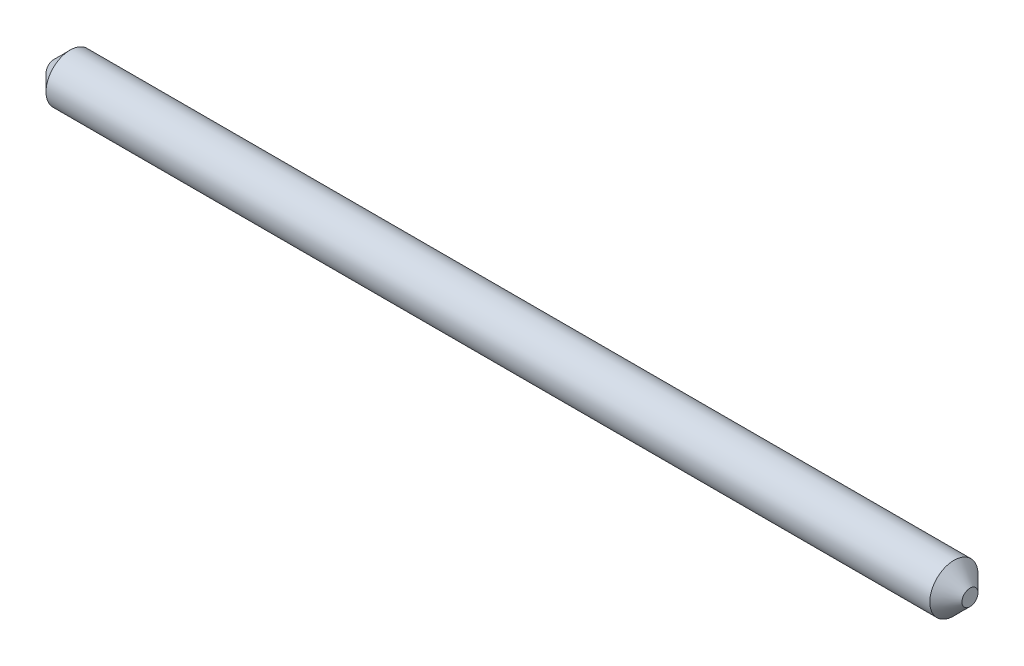
ISO-10303-21;
HEADER;
FILE_DESCRIPTION(('STEP AP214'),'2;1');
FILE_NAME('part.step','',(''),(''),'','','');
FILE_SCHEMA(('AUTOMOTIVE_DESIGN { 1 0 10303 214 1 1 1 1 }'));
ENDSEC;
DATA;
#1=APPLICATION_CONTEXT('core data for automotive mechanical design processes');
#2=APPLICATION_PROTOCOL_DEFINITION('international standard','automotive_design',2000,#1);
#3=PRODUCT_CONTEXT('',#1,'mechanical');
#4=PRODUCT('Part','Part','',(#3));
#5=PRODUCT_RELATED_PRODUCT_CATEGORY('part','',(#4));
#6=PRODUCT_DEFINITION_FORMATION('','',#4);
#7=PRODUCT_DEFINITION_CONTEXT('part definition',#1,'design');
#8=PRODUCT_DEFINITION('design','',#6,#7);
#9=PRODUCT_DEFINITION_SHAPE('','',#8);
#10=(LENGTH_UNIT() NAMED_UNIT(*) SI_UNIT(.MILLI.,.METRE.));
#11=(NAMED_UNIT(*) PLANE_ANGLE_UNIT() SI_UNIT($,.RADIAN.));
#12=(NAMED_UNIT(*) SI_UNIT($,.STERADIAN.) SOLID_ANGLE_UNIT());
#13=UNCERTAINTY_MEASURE_WITH_UNIT(LENGTH_MEASURE(1.E-05),#10,'distance_accuracy_value','');
#14=(GEOMETRIC_REPRESENTATION_CONTEXT(3) GLOBAL_UNCERTAINTY_ASSIGNED_CONTEXT((#13)) GLOBAL_UNIT_ASSIGNED_CONTEXT((#10,
#11,#12)) REPRESENTATION_CONTEXT('',''));
#15=CARTESIAN_POINT('',(0.,0.,0.));
#16=DIRECTION('',(0.,0.,1.));
#17=DIRECTION('',(1.,0.,0.));
#18=AXIS2_PLACEMENT_3D('',#15,#16,#17);
#19=CARTESIAN_POINT('',(28.5,0.,0.));
#20=DIRECTION('',(-1.,0.,0.));
#21=DIRECTION('',(0.,0.,1.));
#22=AXIS2_PLACEMENT_3D('',#19,#20,#21);
#23=CYLINDRICAL_SURFACE('',#22,1.5);
#24=CARTESIAN_POINT('',(-27.5,0.,0.));
#25=DIRECTION('',(1.,0.,0.));
#26=DIRECTION('',(0.,0.,-1.));
#27=AXIS2_PLACEMENT_3D('',#24,#25,#26);
#28=CIRCLE('',#27,1.5);
#29=CARTESIAN_POINT('',(-27.5,0.,1.5));
#30=VERTEX_POINT('',#29);
#31=EDGE_CURVE('E53',#30,#30,#28,.T.);
#32=CARTESIAN_POINT('',(27.5,0.,0.));
#33=DIRECTION('',(1.,0.,0.));
#34=DIRECTION('',(0.,0.,-1.));
#35=AXIS2_PLACEMENT_3D('',#32,#33,#34);
#36=CIRCLE('',#35,1.5);
#37=CARTESIAN_POINT('',(27.5,0.,1.5));
#38=VERTEX_POINT('',#37);
#39=EDGE_CURVE('E59',#38,#38,#36,.F.);
#40=CARTESIAN_POINT('',(-27.5,0.,1.5));
#41=CARTESIAN_POINT('',(-26.9270833333333,0.,1.5));
#42=CARTESIAN_POINT('',(-26.3541666666667,0.,1.5));
#43=CARTESIAN_POINT('',(-25.2083333333333,0.,1.5));
#44=CARTESIAN_POINT('',(-24.6354166666667,0.,1.5));
#45=CARTESIAN_POINT('',(-23.4895833333333,0.,1.5));
#46=CARTESIAN_POINT('',(-22.9166666666667,0.,1.5));
#47=CARTESIAN_POINT('',(-21.7708333333333,0.,1.5));
#48=CARTESIAN_POINT('',(-21.1979166666667,0.,1.5));
#49=CARTESIAN_POINT('',(-20.0520833333333,0.,1.5));
#50=CARTESIAN_POINT('',(-19.4791666666667,0.,1.5));
#51=CARTESIAN_POINT('',(-18.3333333333333,0.,1.5));
#52=CARTESIAN_POINT('',(-17.7604166666667,0.,1.5));
#53=CARTESIAN_POINT('',(-16.6145833333333,0.,1.5));
#54=CARTESIAN_POINT('',(-16.0416666666667,0.,1.5));
#55=CARTESIAN_POINT('',(-14.8958333333333,0.,1.5));
#56=CARTESIAN_POINT('',(-14.3229166666667,0.,1.5));
#57=CARTESIAN_POINT('',(-13.1770833333333,0.,1.5));
#58=CARTESIAN_POINT('',(-12.6041666666667,0.,1.5));
#59=CARTESIAN_POINT('',(-11.4583333333333,0.,1.5));
#60=CARTESIAN_POINT('',(-10.8854166666667,0.,1.5));
#61=CARTESIAN_POINT('',(-9.73958333333332,0.,1.5));
#62=CARTESIAN_POINT('',(-9.16666666666666,0.,1.5));
#63=CARTESIAN_POINT('',(-8.02083333333332,0.,1.5));
#64=CARTESIAN_POINT('',(-7.44791666666665,0.,1.5));
#65=CARTESIAN_POINT('',(-6.30208333333332,0.,1.5));
#66=CARTESIAN_POINT('',(-5.72916666666665,0.,1.5));
#67=CARTESIAN_POINT('',(-4.58333333333332,0.,1.5));
#68=CARTESIAN_POINT('',(-4.01041666666666,0.,1.5));
#69=CARTESIAN_POINT('',(-2.86458333333332,0.,1.5));
#70=CARTESIAN_POINT('',(-2.29166666666666,0.,1.5));
#71=CARTESIAN_POINT('',(-1.14583333333332,0.,1.5));
#72=CARTESIAN_POINT('',(-0.572916666666657,0.,1.5));
#73=CARTESIAN_POINT('',(0.572916666666678,0.,1.5));
#74=CARTESIAN_POINT('',(1.14583333333334,0.,1.5));
#75=CARTESIAN_POINT('',(2.29166666666668,0.,1.5));
#76=CARTESIAN_POINT('',(2.86458333333334,0.,1.5));
#77=CARTESIAN_POINT('',(4.01041666666668,0.,1.5));
#78=CARTESIAN_POINT('',(4.58333333333334,0.,1.5));
#79=CARTESIAN_POINT('',(5.72916666666668,0.,1.5));
#80=CARTESIAN_POINT('',(6.30208333333334,0.,1.5));
#81=CARTESIAN_POINT('',(7.44791666666668,0.,1.5));
#82=CARTESIAN_POINT('',(8.02083333333335,0.,1.5));
#83=CARTESIAN_POINT('',(9.16666666666668,0.,1.5));
#84=CARTESIAN_POINT('',(9.73958333333335,0.,1.5));
#85=CARTESIAN_POINT('',(10.8854166666667,0.,1.5));
#86=CARTESIAN_POINT('',(11.4583333333333,0.,1.5));
#87=CARTESIAN_POINT('',(12.6041666666667,0.,1.5));
#88=CARTESIAN_POINT('',(13.1770833333333,0.,1.5));
#89=CARTESIAN_POINT('',(14.3229166666667,0.,1.5));
#90=CARTESIAN_POINT('',(14.8958333333333,0.,1.5));
#91=CARTESIAN_POINT('',(16.0416666666667,0.,1.5));
#92=CARTESIAN_POINT('',(16.6145833333333,0.,1.5));
#93=CARTESIAN_POINT('',(17.7604166666667,0.,1.5));
#94=CARTESIAN_POINT('',(18.3333333333333,0.,1.5));
#95=CARTESIAN_POINT('',(19.4791666666667,0.,1.5));
#96=CARTESIAN_POINT('',(20.0520833333333,0.,1.5));
#97=CARTESIAN_POINT('',(21.1979166666667,0.,1.5));
#98=CARTESIAN_POINT('',(21.7708333333333,0.,1.5));
#99=CARTESIAN_POINT('',(22.9166666666667,0.,1.5));
#100=CARTESIAN_POINT('',(23.4895833333333,0.,1.5));
#101=CARTESIAN_POINT('',(24.6354166666667,0.,1.5));
#102=CARTESIAN_POINT('',(25.2083333333333,0.,1.5));
#103=CARTESIAN_POINT('',(26.3541666666667,0.,1.5));
#104=CARTESIAN_POINT('',(26.9270833333333,0.,1.5));
#105=CARTESIAN_POINT('',(27.5,0.,1.5));
#106=B_SPLINE_CURVE_WITH_KNOTS('',3,(#40,#41,#42,#43,#44,#45,#46,#47,#48,#49,#50,#51,#52,#53,
#54,#55,#56,#57,#58,#59,#60,#61,#62,#63,#64,#65,#66,#67,#68,#69,#70,#71,#72,#73,#74,#75,#76,#77,
#78,#79,#80,#81,#82,#83,#84,#85,#86,#87,#88,#89,#90,#91,#92,#93,#94,#95,#96,#97,#98,#99,#100,
#101,#102,#103,#104,#105),.UNSPECIFIED.,.F.,.F.,(4,2,2,2,2,2,2,2,2,2,2,2,2,2,2,2,2,2,2,2,2,2,2,
2,2,2,2,2,2,2,2,2,4),(0.,1.71875,3.4375,5.15625,6.875,8.59375,10.3125,12.03125,13.75,15.46875,
17.1875,18.90625,20.625,22.34375,24.0625,25.78125,27.5,29.21875,30.9375,32.65625,34.375,
36.09375,37.8125,39.53125,41.25,42.96875,44.6875,46.40625,48.125,49.84375,51.5625,53.28125,55.),.UNSPECIFIED.);
#107=EDGE_CURVE('BSEAM38',#30,#38,#106,.T.);
#108=ORIENTED_EDGE('',*,*,#31,.T.);
#109=ORIENTED_EDGE('',*,*,#39,.T.);
#110=ORIENTED_EDGE('',*,*,#107,.T.);
#111=ORIENTED_EDGE('',*,*,#107,.F.);
#112=EDGE_LOOP('',(#108,#110,#109,#111));
#113=FACE_BOUND('',#112,.T.);
#114=ADVANCED_FACE('F38',(#113),#23,.T.);
#115=CARTESIAN_POINT('',(28.5,0.,0.));
#116=DIRECTION('',(1.,0.,0.));
#117=DIRECTION('',(0.,0.,-1.));
#118=AXIS2_PLACEMENT_3D('',#115,#116,#117);
#119=PLANE('',#118);
#120=CARTESIAN_POINT('',(28.5,0.,0.));
#121=DIRECTION('',(1.,0.,0.));
#122=DIRECTION('',(0.,0.,-1.));
#123=AXIS2_PLACEMENT_3D('',#120,#121,#122);
#124=CIRCLE('',#123,0.500000000000021);
#125=CARTESIAN_POINT('',(28.5,0.,0.500000000000023));
#126=VERTEX_POINT('',#125);
#127=EDGE_CURVE('E10',#126,#126,#124,.T.);
#128=ORIENTED_EDGE('',*,*,#127,.T.);
#129=EDGE_LOOP('',(#128));
#130=FACE_BOUND('',#129,.T.);
#131=ADVANCED_FACE('F77',(#130),#119,.T.);
#132=CARTESIAN_POINT('',(-28.5,0.,0.));
#133=DIRECTION('',(1.,0.,0.));
#134=DIRECTION('',(0.,0.,-1.));
#135=AXIS2_PLACEMENT_3D('',#132,#133,#134);
#136=PLANE('',#135);
#137=CARTESIAN_POINT('',(-28.5,0.,0.));
#138=DIRECTION('',(1.,0.,0.));
#139=DIRECTION('',(0.,0.,-1.));
#140=AXIS2_PLACEMENT_3D('',#137,#138,#139);
#141=CIRCLE('',#140,0.499999999999951);
#142=CARTESIAN_POINT('',(-28.5,0.,-0.499999999999951));
#143=VERTEX_POINT('',#142);
#144=EDGE_CURVE('E47',#143,#143,#141,.F.);
#145=ORIENTED_EDGE('',*,*,#144,.T.);
#146=EDGE_LOOP('',(#145));
#147=FACE_BOUND('',#146,.T.);
#148=ADVANCED_FACE('F74',(#147),#136,.F.);
#149=CARTESIAN_POINT('',(-27.5,0.,0.));
#150=DIRECTION('',(1.,0.,0.));
#151=DIRECTION('',(0.,0.,-1.));
#152=AXIS2_PLACEMENT_3D('',#149,#150,#151);
#153=CONICAL_SURFACE('',#152,1.5,0.785398163397462);
#154=ORIENTED_EDGE('',*,*,#144,.F.);
#155=EDGE_LOOP('',(#154));
#156=FACE_BOUND('',#155,.T.);
#157=ORIENTED_EDGE('',*,*,#31,.F.);
#158=EDGE_LOOP('',(#157));
#159=FACE_BOUND('',#158,.T.);
#160=ADVANCED_FACE('F70',(#156,#159),#153,.T.);
#161=CARTESIAN_POINT('',(28.5,0.,0.));
#162=DIRECTION('',(-1.,0.,0.));
#163=DIRECTION('',(0.,0.,1.));
#164=AXIS2_PLACEMENT_3D('',#161,#162,#163);
#165=CONICAL_SURFACE('',#164,0.500000000000021,0.785398163397446);
#166=CARTESIAN_POINT('',(27.5,0.,1.5));
#167=CARTESIAN_POINT('',(27.5104166666667,0.,1.48958333333334));
#168=CARTESIAN_POINT('',(27.5208333333333,0.,1.47916666666667));
#169=CARTESIAN_POINT('',(27.5416666666667,0.,1.45833333333334));
#170=CARTESIAN_POINT('',(27.5520833333333,0.,1.44791666666667));
#171=CARTESIAN_POINT('',(27.5729166666667,0.,1.42708333333334));
#172=CARTESIAN_POINT('',(27.5833333333333,0.,1.41666666666667));
#173=CARTESIAN_POINT('',(27.6041666666667,0.,1.39583333333334));
#174=CARTESIAN_POINT('',(27.6145833333333,0.,1.38541666666667));
#175=CARTESIAN_POINT('',(27.6354166666667,0.,1.36458333333334));
#176=CARTESIAN_POINT('',(27.6458333333333,0.,1.35416666666667));
#177=CARTESIAN_POINT('',(27.6666666666667,0.,1.33333333333334));
#178=CARTESIAN_POINT('',(27.6770833333333,0.,1.32291666666667));
#179=CARTESIAN_POINT('',(27.6979166666667,0.,1.30208333333334));
#180=CARTESIAN_POINT('',(27.7083333333333,0.,1.29166666666668));
#181=CARTESIAN_POINT('',(27.7291666666667,0.,1.27083333333334));
#182=CARTESIAN_POINT('',(27.7395833333333,0.,1.26041666666668));
#183=CARTESIAN_POINT('',(27.7604166666667,0.,1.23958333333334));
#184=CARTESIAN_POINT('',(27.7708333333333,0.,1.22916666666668));
#185=CARTESIAN_POINT('',(27.7916666666667,0.,1.20833333333334));
#186=CARTESIAN_POINT('',(27.8020833333333,0.,1.19791666666668));
#187=CARTESIAN_POINT('',(27.8229166666667,0.,1.17708333333334));
#188=CARTESIAN_POINT('',(27.8333333333333,0.,1.16666666666668));
#189=CARTESIAN_POINT('',(27.8541666666667,0.,1.14583333333334));
#190=CARTESIAN_POINT('',(27.8645833333333,0.,1.13541666666668));
#191=CARTESIAN_POINT('',(27.8854166666667,0.,1.11458333333335));
#192=CARTESIAN_POINT('',(27.8958333333333,0.,1.10416666666668));
#193=CARTESIAN_POINT('',(27.9166666666667,0.,1.08333333333335));
#194=CARTESIAN_POINT('',(27.9270833333333,0.,1.07291666666668));
#195=CARTESIAN_POINT('',(27.9479166666667,0.,1.05208333333335));
#196=CARTESIAN_POINT('',(27.9583333333333,0.,1.04166666666668));
#197=CARTESIAN_POINT('',(27.9791666666667,0.,1.02083333333335));
#198=CARTESIAN_POINT('',(27.9895833333333,0.,1.01041666666668));
#199=CARTESIAN_POINT('',(28.0104166666667,0.,0.989583333333347));
#200=CARTESIAN_POINT('',(28.0208333333333,0.,0.979166666666681));
#201=CARTESIAN_POINT('',(28.0416666666667,0.,0.958333333333347));
#202=CARTESIAN_POINT('',(28.0520833333333,0.,0.947916666666681));
#203=CARTESIAN_POINT('',(28.0729166666667,0.,0.927083333333348));
#204=CARTESIAN_POINT('',(28.0833333333333,0.,0.916666666666682));
#205=CARTESIAN_POINT('',(28.1041666666667,0.,0.895833333333349));
#206=CARTESIAN_POINT('',(28.1145833333333,0.,0.885416666666682));
#207=CARTESIAN_POINT('',(28.1354166666667,0.,0.864583333333349));
#208=CARTESIAN_POINT('',(28.1458333333333,0.,0.854166666666683));
#209=CARTESIAN_POINT('',(28.1666666666667,0.,0.83333333333335));
#210=CARTESIAN_POINT('',(28.1770833333333,0.,0.822916666666683));
#211=CARTESIAN_POINT('',(28.1979166666667,0.,0.802083333333351));
#212=CARTESIAN_POINT('',(28.2083333333333,0.,0.791666666666684));
#213=CARTESIAN_POINT('',(28.2291666666667,0.,0.770833333333351));
#214=CARTESIAN_POINT('',(28.2395833333333,0.,0.760416666666684));
#215=CARTESIAN_POINT('',(28.2604166666667,0.,0.739583333333351));
#216=CARTESIAN_POINT('',(28.2708333333333,0.,0.729166666666685));
#217=CARTESIAN_POINT('',(28.2916666666667,0.,0.708333333333352));
#218=CARTESIAN_POINT('',(28.3020833333333,0.,0.697916666666686));
#219=CARTESIAN_POINT('',(28.3229166666667,0.,0.677083333333353));
#220=CARTESIAN_POINT('',(28.3333333333333,0.,0.666666666666686));
#221=CARTESIAN_POINT('',(28.3541666666667,0.,0.645833333333353));
#222=CARTESIAN_POINT('',(28.3645833333333,0.,0.635416666666687));
#223=CARTESIAN_POINT('',(28.3854166666667,0.,0.614583333333354));
#224=CARTESIAN_POINT('',(28.3958333333333,0.,0.604166666666687));
#225=CARTESIAN_POINT('',(28.4166666666667,0.,0.583333333333354));
#226=CARTESIAN_POINT('',(28.4270833333333,0.,0.572916666666688));
#227=CARTESIAN_POINT('',(28.4479166666667,0.,0.552083333333355));
#228=CARTESIAN_POINT('',(28.4583333333333,0.,0.541666666666689));
#229=CARTESIAN_POINT('',(28.4791666666667,0.,0.520833333333356));
#230=CARTESIAN_POINT('',(28.4895833333333,0.,0.510416666666689));
#231=CARTESIAN_POINT('',(28.5,0.,0.500000000000023));
#232=B_SPLINE_CURVE_WITH_KNOTS('',3,(#166,#167,#168,#169,#170,#171,#172,#173,#174,#175,#176,
#177,#178,#179,#180,#181,#182,#183,#184,#185,#186,#187,#188,#189,#190,#191,#192,#193,#194,#195,
#196,#197,#198,#199,#200,#201,#202,#203,#204,#205,#206,#207,#208,#209,#210,#211,#212,#213,#214,
#215,#216,#217,#218,#219,#220,#221,#222,#223,#224,#225,#226,#227,#228,#229,#230,#231),
.UNSPECIFIED.,.F.,.F.,(4,2,2,2,2,2,2,2,2,2,2,2,2,2,2,2,2,2,2,2,2,2,2,2,2,2,2,2,2,2,2,2,4),(0.,
0.0441941738241565,0.0883883476483153,0.132582521472474,0.176776695296633,0.220970869120792,
0.265165042944951,0.30935921676911,0.353553390593266,0.397747564417425,0.441941738241584,
0.486135912065742,0.530330085889901,0.57452425971406,0.618718433538219,0.662912607362378,
0.707106781186537,0.751300955010693,0.795495128834852,0.839689302659011,0.88388347648317,
0.928077650307329,0.972271824131487,1.01646599795565,1.0606601717798,1.10485434560396,
1.14904851942812,1.19324269325228,1.23743686707644,1.2816310409006,1.32582521472476,
1.37001938854891,1.41421356237307),.UNSPECIFIED.);
#233=EDGE_CURVE('BSEAM41',#38,#126,#232,.T.);
#234=ORIENTED_EDGE('',*,*,#39,.F.);
#235=ORIENTED_EDGE('',*,*,#127,.F.);
#236=ORIENTED_EDGE('',*,*,#233,.T.);
#237=ORIENTED_EDGE('',*,*,#233,.F.);
#238=EDGE_LOOP('',(#234,#236,#235,#237));
#239=FACE_BOUND('',#238,.T.);
#240=ADVANCED_FACE('F41',(#239),#165,.T.);
#241=CLOSED_SHELL('',(#114,#131,#148,#160,#240));
#242=MANIFOLD_SOLID_BREP('B2',#241);
#243=ADVANCED_BREP_SHAPE_REPRESENTATION('',(#18,#242),#14);
#244=SHAPE_DEFINITION_REPRESENTATION(#9,#243);
ENDSEC;
END-ISO-10303-21;
